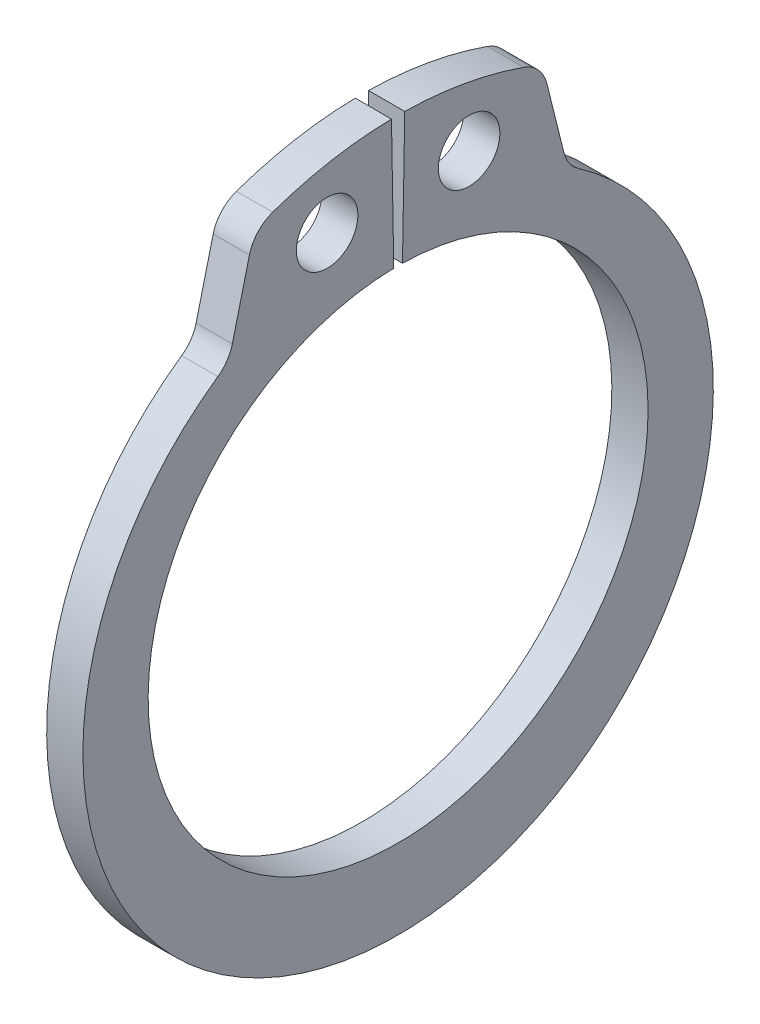
ISO-10303-21;
HEADER;
FILE_DESCRIPTION(('STEP AP214'),'2;1');
FILE_NAME('part.step','',(''),(''),'','','');
FILE_SCHEMA(('AUTOMOTIVE_DESIGN { 1 0 10303 214 1 1 1 1 }'));
ENDSEC;
DATA;
#1=APPLICATION_CONTEXT('core data for automotive mechanical design processes');
#2=APPLICATION_PROTOCOL_DEFINITION('international standard','automotive_design',2000,#1);
#3=PRODUCT_CONTEXT('',#1,'mechanical');
#4=PRODUCT('Part','Part','',(#3));
#5=PRODUCT_RELATED_PRODUCT_CATEGORY('part','',(#4));
#6=PRODUCT_DEFINITION_FORMATION('','',#4);
#7=PRODUCT_DEFINITION_CONTEXT('part definition',#1,'design');
#8=PRODUCT_DEFINITION('design','',#6,#7);
#9=PRODUCT_DEFINITION_SHAPE('','',#8);
#10=(LENGTH_UNIT() NAMED_UNIT(*) SI_UNIT(.MILLI.,.METRE.));
#11=(NAMED_UNIT(*) PLANE_ANGLE_UNIT() SI_UNIT($,.RADIAN.));
#12=(NAMED_UNIT(*) SI_UNIT($,.STERADIAN.) SOLID_ANGLE_UNIT());
#13=UNCERTAINTY_MEASURE_WITH_UNIT(LENGTH_MEASURE(1.E-05),#10,'distance_accuracy_value','');
#14=(GEOMETRIC_REPRESENTATION_CONTEXT(3) GLOBAL_UNCERTAINTY_ASSIGNED_CONTEXT((#13)) GLOBAL_UNIT_ASSIGNED_CONTEXT((#10,
#11,#12)) REPRESENTATION_CONTEXT('',''));
#15=CARTESIAN_POINT('',(0.,0.,0.));
#16=DIRECTION('',(0.,0.,1.));
#17=DIRECTION('',(1.,0.,0.));
#18=AXIS2_PLACEMENT_3D('',#15,#16,#17);
#19=CARTESIAN_POINT('',(0.5,0.,0.));
#20=DIRECTION('',(1.,0.,0.));
#21=DIRECTION('',(0.,0.,-1.));
#22=AXIS2_PLACEMENT_3D('',#19,#20,#21);
#23=PLANE('',#22);
#24=CARTESIAN_POINT('',(0.5,8.66711980549086,1.9596288316201));
#25=DIRECTION('',(1.,0.,0.));
#26=DIRECTION('',(0.,0.,-1.));
#27=AXIS2_PLACEMENT_3D('',#24,#25,#26);
#28=CIRCLE('',#27,0.85);
#29=CARTESIAN_POINT('',(0.5,8.66711980549086,1.1096288316201));
#30=VERTEX_POINT('',#29);
#31=EDGE_CURVE('E219',#30,#30,#28,.T.);
#32=ORIENTED_EDGE('',*,*,#31,.F.);
#33=EDGE_LOOP('',(#32));
#34=FACE_BOUND('',#33,.T.);
#35=CARTESIAN_POINT('',(0.5,0.,0.));
#36=DIRECTION('',(1.,0.,0.));
#37=DIRECTION('',(0.,0.,-1.));
#38=AXIS2_PLACEMENT_3D('',#35,#36,#37);
#39=CIRCLE('',#38,10.5);
#40=CARTESIAN_POINT('',(0.5,10.4984007991421,0.183250267591477));
#41=VERTEX_POINT('',#40);
#42=CARTESIAN_POINT('',(0.5,9.91217887924345,3.46391539531209));
#43=VERTEX_POINT('',#42);
#44=EDGE_CURVE('E136',#41,#43,#39,.T.);
#45=ORIENTED_EDGE('',*,*,#44,.T.);
#46=CARTESIAN_POINT('',(0.5,8.96816184312502,3.13401869099665));
#47=DIRECTION('',(1.,0.,0.));
#48=DIRECTION('',(0.,0.,-1.));
#49=AXIS2_PLACEMENT_3D('',#46,#47,#48);
#50=CIRCLE('',#49,1.);
#51=CARTESIAN_POINT('',(0.5,9.21008373872469,4.10431441727265));
#52=VERTEX_POINT('',#51);
#53=EDGE_CURVE('E173',#43,#52,#50,.T.);
#54=ORIENTED_EDGE('',*,*,#53,.T.);
#55=DIRECTION('',(0.,-0.970295726275997,0.241921895599665));
#56=VECTOR('',#55,1.);
#57=CARTESIAN_POINT('',(0.5,9.71734472745919,3.97784004803122));
#58=LINE('',#57,#56);
#59=CARTESIAN_POINT('',(0.5,7.31761530924591,4.57615979123836));
#60=VERTEX_POINT('',#59);
#61=EDGE_CURVE('E211',#52,#60,#58,.T.);
#62=ORIENTED_EDGE('',*,*,#61,.T.);
#63=CARTESIAN_POINT('',(0.5,7.55953720484558,5.54645551751436));
#64=DIRECTION('',(1.,0.,0.));
#65=DIRECTION('',(0.,0.,-1.));
#66=AXIS2_PLACEMENT_3D('',#63,#64,#65);
#67=CIRCLE('',#66,1.);
#68=CARTESIAN_POINT('',(0.5,6.73911195964233,4.97470170945253));
#69=VERTEX_POINT('',#68);
#70=EDGE_CURVE('E184',#60,#69,#67,.F.);
#71=ORIENTED_EDGE('',*,*,#70,.T.);
#72=CARTESIAN_POINT('',(0.5,-0.399224177769538,0.));
#73=DIRECTION('',(1.,0.,0.));
#74=DIRECTION('',(0.,0.,-1.));
#75=AXIS2_PLACEMENT_3D('',#72,#73,#74);
#76=CIRCLE('',#75,8.70077582223046);
#77=CARTESIAN_POINT('',(0.5,6.73911195964233,-4.97470170945253));
#78=VERTEX_POINT('',#77);
#79=EDGE_CURVE('E206',#69,#78,#76,.T.);
#80=ORIENTED_EDGE('',*,*,#79,.T.);
#81=CARTESIAN_POINT('',(0.5,7.55953720484557,-5.54645551751436));
#82=DIRECTION('',(1.,0.,0.));
#83=DIRECTION('',(0.,0.,-1.));
#84=AXIS2_PLACEMENT_3D('',#81,#82,#83);
#85=CIRCLE('',#84,1.);
#86=CARTESIAN_POINT('',(0.5,7.31761530924591,-4.57615979123836));
#87=VERTEX_POINT('',#86);
#88=EDGE_CURVE('E11',#78,#87,#85,.F.);
#89=ORIENTED_EDGE('',*,*,#88,.T.);
#90=DIRECTION('',(0.,0.970295726275997,0.241921895599666));
#91=VECTOR('',#90,1.);
#92=CARTESIAN_POINT('',(0.5,9.71734472745919,-3.97784004803122));
#93=LINE('',#92,#91);
#94=CARTESIAN_POINT('',(0.5,9.21008373872469,-4.10431441727265));
#95=VERTEX_POINT('',#94);
#96=EDGE_CURVE('E205',#87,#95,#93,.T.);
#97=ORIENTED_EDGE('',*,*,#96,.T.);
#98=CARTESIAN_POINT('',(0.5,8.96816184312502,-3.13401869099666));
#99=DIRECTION('',(1.,0.,0.));
#100=DIRECTION('',(0.,0.,-1.));
#101=AXIS2_PLACEMENT_3D('',#98,#99,#100);
#102=CIRCLE('',#101,1.);
#103=CARTESIAN_POINT('',(0.5,9.91217887924345,-3.46391539531209));
#104=VERTEX_POINT('',#103);
#105=EDGE_CURVE('E51',#95,#104,#102,.T.);
#106=ORIENTED_EDGE('',*,*,#105,.T.);
#107=CARTESIAN_POINT('',(0.5,0.,0.));
#108=DIRECTION('',(1.,0.,0.));
#109=DIRECTION('',(0.,0.,1.));
#110=AXIS2_PLACEMENT_3D('',#107,#108,#109);
#111=CIRCLE('',#110,10.5);
#112=CARTESIAN_POINT('',(0.5,10.4984007991421,-0.183250267591479));
#113=VERTEX_POINT('',#112);
#114=EDGE_CURVE('E208',#104,#113,#111,.T.);
#115=ORIENTED_EDGE('',*,*,#114,.T.);
#116=DIRECTION('',(0.,-0.999847695156391,0.0174524064372841));
#117=VECTOR('',#116,1.);
#118=CARTESIAN_POINT('',(0.5,10.4984007991421,-0.183250267591479));
#119=LINE('',#118,#117);
#120=CARTESIAN_POINT('',(0.5,6.8989490965791,-0.120421604417257));
#121=VERTEX_POINT('',#120);
#122=EDGE_CURVE('E142',#113,#121,#119,.T.);
#123=ORIENTED_EDGE('',*,*,#122,.T.);
#124=CARTESIAN_POINT('',(0.5,0.,0.));
#125=DIRECTION('',(-1.,0.,0.));
#126=DIRECTION('',(0.,0.,-1.));
#127=AXIS2_PLACEMENT_3D('',#124,#125,#126);
#128=CIRCLE('',#127,6.9);
#129=CARTESIAN_POINT('',(0.5,6.8989490965791,0.120421604417257));
#130=VERTEX_POINT('',#129);
#131=EDGE_CURVE('E137',#121,#130,#128,.T.);
#132=ORIENTED_EDGE('',*,*,#131,.T.);
#133=DIRECTION('',(0.,0.999847695156391,0.0174524064372835));
#134=VECTOR('',#133,1.);
#135=CARTESIAN_POINT('',(0.5,6.8989490965791,0.120421604417257));
#136=LINE('',#135,#134);
#137=EDGE_CURVE('E126',#130,#41,#136,.T.);
#138=ORIENTED_EDGE('',*,*,#137,.T.);
#139=EDGE_LOOP('',(#45,#54,#62,#71,#80,#89,#97,#106,#115,#123,#132,#138));
#140=FACE_BOUND('',#139,.T.);
#141=CARTESIAN_POINT('',(0.5,8.66711980549086,-1.9596288316201));
#142=DIRECTION('',(1.,0.,0.));
#143=DIRECTION('',(0.,0.,-1.));
#144=AXIS2_PLACEMENT_3D('',#141,#142,#143);
#145=CIRCLE('',#144,0.85);
#146=CARTESIAN_POINT('',(0.5,8.66711980549086,-2.8096288316201));
#147=VERTEX_POINT('',#146);
#148=EDGE_CURVE('E248',#147,#147,#145,.T.);
#149=ORIENTED_EDGE('',*,*,#148,.F.);
#150=EDGE_LOOP('',(#149));
#151=FACE_BOUND('',#150,.T.);
#152=ADVANCED_FACE('F36',(#34,#140,#151),#23,.T.);
#153=CARTESIAN_POINT('',(-0.5,0.,0.));
#154=DIRECTION('',(1.,0.,0.));
#155=DIRECTION('',(0.,0.,-1.));
#156=AXIS2_PLACEMENT_3D('',#153,#154,#155);
#157=PLANE('',#156);
#158=CARTESIAN_POINT('',(-0.5,8.66711980549086,1.9596288316201));
#159=DIRECTION('',(1.,0.,0.));
#160=DIRECTION('',(0.,0.,-1.));
#161=AXIS2_PLACEMENT_3D('',#158,#159,#160);
#162=CIRCLE('',#161,0.85);
#163=CARTESIAN_POINT('',(-0.5,8.66711980549086,1.1096288316201));
#164=VERTEX_POINT('',#163);
#165=EDGE_CURVE('E245',#164,#164,#162,.T.);
#166=ORIENTED_EDGE('',*,*,#165,.T.);
#167=EDGE_LOOP('',(#166));
#168=FACE_BOUND('',#167,.T.);
#169=DIRECTION('',(0.,-0.970295726275997,0.241921895599665));
#170=VECTOR('',#169,1.);
#171=CARTESIAN_POINT('',(-0.5,9.71734472745919,3.97784004803122));
#172=LINE('',#171,#170);
#173=CARTESIAN_POINT('',(-0.5,9.21008373872469,4.10431441727265));
#174=VERTEX_POINT('',#173);
#175=CARTESIAN_POINT('',(-0.5,7.31761530924591,4.57615979123836));
#176=VERTEX_POINT('',#175);
#177=EDGE_CURVE('E202',#174,#176,#172,.T.);
#178=ORIENTED_EDGE('',*,*,#177,.F.);
#179=CARTESIAN_POINT('',(-0.5,8.96816184312502,3.13401869099665));
#180=DIRECTION('',(1.,0.,0.));
#181=DIRECTION('',(0.,0.,-1.));
#182=AXIS2_PLACEMENT_3D('',#179,#180,#181);
#183=CIRCLE('',#182,1.);
#184=CARTESIAN_POINT('',(-0.5,9.91217887924345,3.46391539531209));
#185=VERTEX_POINT('',#184);
#186=EDGE_CURVE('E168',#174,#185,#183,.F.);
#187=ORIENTED_EDGE('',*,*,#186,.T.);
#188=CARTESIAN_POINT('',(-0.5,0.,0.));
#189=DIRECTION('',(1.,0.,0.));
#190=DIRECTION('',(0.,0.,-1.));
#191=AXIS2_PLACEMENT_3D('',#188,#189,#190);
#192=CIRCLE('',#191,10.5);
#193=CARTESIAN_POINT('',(-0.5,10.4984007991421,0.183250267591477));
#194=VERTEX_POINT('',#193);
#195=EDGE_CURVE('E221',#194,#185,#192,.T.);
#196=ORIENTED_EDGE('',*,*,#195,.F.);
#197=DIRECTION('',(0.,0.999847695156391,0.0174524064372835));
#198=VECTOR('',#197,1.);
#199=CARTESIAN_POINT('',(-0.5,6.8989490965791,0.120421604417257));
#200=LINE('',#199,#198);
#201=CARTESIAN_POINT('',(-0.5,6.8989490965791,0.120421604417257));
#202=VERTEX_POINT('',#201);
#203=EDGE_CURVE('E218',#202,#194,#200,.T.);
#204=ORIENTED_EDGE('',*,*,#203,.F.);
#205=CARTESIAN_POINT('',(-0.5,0.,0.));
#206=DIRECTION('',(-1.,0.,0.));
#207=DIRECTION('',(0.,0.,-1.));
#208=AXIS2_PLACEMENT_3D('',#205,#206,#207);
#209=CIRCLE('',#208,6.9);
#210=CARTESIAN_POINT('',(-0.5,6.8989490965791,-0.120421604417257));
#211=VERTEX_POINT('',#210);
#212=EDGE_CURVE('E150',#211,#202,#209,.T.);
#213=ORIENTED_EDGE('',*,*,#212,.F.);
#214=DIRECTION('',(0.,-0.999847695156391,0.0174524064372841));
#215=VECTOR('',#214,1.);
#216=CARTESIAN_POINT('',(-0.5,10.4984007991421,-0.183250267591479));
#217=LINE('',#216,#215);
#218=CARTESIAN_POINT('',(-0.5,10.4984007991421,-0.183250267591479));
#219=VERTEX_POINT('',#218);
#220=EDGE_CURVE('E146',#219,#211,#217,.T.);
#221=ORIENTED_EDGE('',*,*,#220,.F.);
#222=CARTESIAN_POINT('',(-0.5,0.,0.));
#223=DIRECTION('',(1.,0.,0.));
#224=DIRECTION('',(0.,0.,1.));
#225=AXIS2_PLACEMENT_3D('',#222,#223,#224);
#226=CIRCLE('',#225,10.5);
#227=CARTESIAN_POINT('',(-0.5,9.91217887924345,-3.46391539531209));
#228=VERTEX_POINT('',#227);
#229=EDGE_CURVE('E227',#228,#219,#226,.T.);
#230=ORIENTED_EDGE('',*,*,#229,.F.);
#231=CARTESIAN_POINT('',(-0.5,8.96816184312502,-3.13401869099666));
#232=DIRECTION('',(1.,0.,0.));
#233=DIRECTION('',(0.,0.,-1.));
#234=AXIS2_PLACEMENT_3D('',#231,#232,#233);
#235=CIRCLE('',#234,1.);
#236=CARTESIAN_POINT('',(-0.5,9.21008373872469,-4.10431441727265));
#237=VERTEX_POINT('',#236);
#238=EDGE_CURVE('E166',#228,#237,#235,.F.);
#239=ORIENTED_EDGE('',*,*,#238,.T.);
#240=DIRECTION('',(0.,0.970295726275997,0.241921895599666));
#241=VECTOR('',#240,1.);
#242=CARTESIAN_POINT('',(-0.5,9.71734472745919,-3.97784004803122));
#243=LINE('',#242,#241);
#244=CARTESIAN_POINT('',(-0.5,7.31761530924591,-4.57615979123836));
#245=VERTEX_POINT('',#244);
#246=EDGE_CURVE('E193',#245,#237,#243,.T.);
#247=ORIENTED_EDGE('',*,*,#246,.F.);
#248=CARTESIAN_POINT('',(-0.5,7.55953720484557,-5.54645551751436));
#249=DIRECTION('',(1.,0.,0.));
#250=DIRECTION('',(0.,0.,-1.));
#251=AXIS2_PLACEMENT_3D('',#248,#249,#250);
#252=CIRCLE('',#251,1.);
#253=CARTESIAN_POINT('',(-0.5,6.73911195964233,-4.97470170945253));
#254=VERTEX_POINT('',#253);
#255=EDGE_CURVE('E44',#245,#254,#252,.T.);
#256=ORIENTED_EDGE('',*,*,#255,.T.);
#257=CARTESIAN_POINT('',(-0.5,-0.399224177769538,0.));
#258=DIRECTION('',(1.,0.,0.));
#259=DIRECTION('',(0.,0.,-1.));
#260=AXIS2_PLACEMENT_3D('',#257,#258,#259);
#261=CIRCLE('',#260,8.70077582223046);
#262=CARTESIAN_POINT('',(-0.5,6.73911195964233,4.97470170945253));
#263=VERTEX_POINT('',#262);
#264=EDGE_CURVE('E192',#263,#254,#261,.T.);
#265=ORIENTED_EDGE('',*,*,#264,.F.);
#266=CARTESIAN_POINT('',(-0.5,7.55953720484558,5.54645551751436));
#267=DIRECTION('',(1.,0.,0.));
#268=DIRECTION('',(0.,0.,-1.));
#269=AXIS2_PLACEMENT_3D('',#266,#267,#268);
#270=CIRCLE('',#269,1.);
#271=EDGE_CURVE('E182',#263,#176,#270,.T.);
#272=ORIENTED_EDGE('',*,*,#271,.T.);
#273=EDGE_LOOP('',(#178,#187,#196,#204,#213,#221,#230,#239,#247,#256,#265,#272));
#274=FACE_BOUND('',#273,.T.);
#275=CARTESIAN_POINT('',(-0.5,8.66711980549086,-1.9596288316201));
#276=DIRECTION('',(1.,0.,0.));
#277=DIRECTION('',(0.,0.,-1.));
#278=AXIS2_PLACEMENT_3D('',#275,#276,#277);
#279=CIRCLE('',#278,0.85);
#280=CARTESIAN_POINT('',(-0.5,8.66711980549086,-2.8096288316201));
#281=VERTEX_POINT('',#280);
#282=EDGE_CURVE('E251',#281,#281,#279,.T.);
#283=ORIENTED_EDGE('',*,*,#282,.T.);
#284=EDGE_LOOP('',(#283));
#285=FACE_BOUND('',#284,.T.);
#286=ADVANCED_FACE('F190',(#168,#274,#285),#157,.F.);
#287=CARTESIAN_POINT('',(0.5,0.,0.));
#288=DIRECTION('',(-1.,0.,0.));
#289=DIRECTION('',(0.,0.,1.));
#290=AXIS2_PLACEMENT_3D('',#287,#288,#289);
#291=CYLINDRICAL_SURFACE('',#290,6.9);
#292=ORIENTED_EDGE('',*,*,#212,.T.);
#293=DIRECTION('',(-1.,0.,0.));
#294=VECTOR('',#293,1.);
#295=CARTESIAN_POINT('',(0.5,6.8989490965791,0.120421604417257));
#296=LINE('',#295,#294);
#297=EDGE_CURVE('E130',#130,#202,#296,.T.);
#298=ORIENTED_EDGE('',*,*,#297,.F.);
#299=ORIENTED_EDGE('',*,*,#131,.F.);
#300=DIRECTION('',(-1.,0.,0.));
#301=VECTOR('',#300,1.);
#302=CARTESIAN_POINT('',(0.5,6.8989490965791,-0.120421604417257));
#303=LINE('',#302,#301);
#304=EDGE_CURVE('E216',#121,#211,#303,.T.);
#305=ORIENTED_EDGE('',*,*,#304,.T.);
#306=EDGE_LOOP('',(#292,#298,#299,#305));
#307=FACE_BOUND('',#306,.T.);
#308=ADVANCED_FACE('F148',(#307),#291,.F.);
#309=CARTESIAN_POINT('',(0.5,6.8989490965791,0.120421604417257));
#310=DIRECTION('',(0.,-0.0174524064372835,0.999847695156391));
#311=DIRECTION('',(0.,-0.999847695156391,-0.0174524064372835));
#312=AXIS2_PLACEMENT_3D('',#309,#310,#311);
#313=PLANE('',#312);
#314=ORIENTED_EDGE('',*,*,#203,.T.);
#315=DIRECTION('',(-1.,0.,0.));
#316=VECTOR('',#315,1.);
#317=CARTESIAN_POINT('',(0.5,10.4984007991421,0.183250267591477));
#318=LINE('',#317,#316);
#319=EDGE_CURVE('E133',#41,#194,#318,.T.);
#320=ORIENTED_EDGE('',*,*,#319,.F.);
#321=ORIENTED_EDGE('',*,*,#137,.F.);
#322=ORIENTED_EDGE('',*,*,#297,.T.);
#323=EDGE_LOOP('',(#314,#320,#321,#322));
#324=FACE_BOUND('',#323,.T.);
#325=ADVANCED_FACE('F128',(#324),#313,.F.);
#326=CARTESIAN_POINT('',(0.5,0.,0.));
#327=DIRECTION('',(-1.,0.,0.));
#328=DIRECTION('',(0.,0.,1.));
#329=AXIS2_PLACEMENT_3D('',#326,#327,#328);
#330=CYLINDRICAL_SURFACE('',#329,10.5);
#331=ORIENTED_EDGE('',*,*,#195,.T.);
#332=DIRECTION('',(-1.,0.,0.));
#333=VECTOR('',#332,1.);
#334=CARTESIAN_POINT('',(0.5,9.91217887924345,3.46391539531209));
#335=LINE('',#334,#333);
#336=EDGE_CURVE('E170',#185,#43,#335,.F.);
#337=ORIENTED_EDGE('',*,*,#336,.T.);
#338=ORIENTED_EDGE('',*,*,#44,.F.);
#339=ORIENTED_EDGE('',*,*,#319,.T.);
#340=EDGE_LOOP('',(#331,#337,#338,#339));
#341=FACE_BOUND('',#340,.T.);
#342=ADVANCED_FACE('F239',(#341),#330,.T.);
#343=CARTESIAN_POINT('',(0.5,9.71734472745919,3.97784004803122));
#344=DIRECTION('',(0.,-0.241921895599665,-0.970295726275997));
#345=DIRECTION('',(0.,0.970295726275997,-0.241921895599665));
#346=AXIS2_PLACEMENT_3D('',#343,#344,#345);
#347=PLANE('',#346);
#348=ORIENTED_EDGE('',*,*,#177,.T.);
#349=DIRECTION('',(1.,0.,0.));
#350=VECTOR('',#349,1.);
#351=CARTESIAN_POINT('',(0.5,7.31761530924591,4.57615979123836));
#352=LINE('',#351,#350);
#353=EDGE_CURVE('E164',#176,#60,#352,.T.);
#354=ORIENTED_EDGE('',*,*,#353,.T.);
#355=ORIENTED_EDGE('',*,*,#61,.F.);
#356=DIRECTION('',(-1.,0.,0.));
#357=VECTOR('',#356,1.);
#358=CARTESIAN_POINT('',(0.5,9.21008373872469,4.10431441727265));
#359=LINE('',#358,#357);
#360=EDGE_CURVE('E161',#52,#174,#359,.T.);
#361=ORIENTED_EDGE('',*,*,#360,.T.);
#362=EDGE_LOOP('',(#348,#354,#355,#361));
#363=FACE_BOUND('',#362,.T.);
#364=ADVANCED_FACE('F281',(#363),#347,.F.);
#365=CARTESIAN_POINT('',(0.5,-0.399224177769538,0.));
#366=DIRECTION('',(-1.,0.,0.));
#367=DIRECTION('',(0.,0.,1.));
#368=AXIS2_PLACEMENT_3D('',#365,#366,#367);
#369=CYLINDRICAL_SURFACE('',#368,8.70077582223046);
#370=ORIENTED_EDGE('',*,*,#79,.F.);
#371=DIRECTION('',(-1.,0.,0.));
#372=VECTOR('',#371,1.);
#373=CARTESIAN_POINT('',(0.5,6.73911195964233,4.97470170945253));
#374=LINE('',#373,#372);
#375=EDGE_CURVE('E153',#69,#263,#374,.T.);
#376=ORIENTED_EDGE('',*,*,#375,.T.);
#377=ORIENTED_EDGE('',*,*,#264,.T.);
#378=DIRECTION('',(-1.,0.,0.));
#379=VECTOR('',#378,1.);
#380=CARTESIAN_POINT('',(0.5,6.73911195964233,-4.97470170945253));
#381=LINE('',#380,#379);
#382=EDGE_CURVE('E151',#254,#78,#381,.F.);
#383=ORIENTED_EDGE('',*,*,#382,.T.);
#384=EDGE_LOOP('',(#370,#376,#377,#383));
#385=FACE_BOUND('',#384,.T.);
#386=ADVANCED_FACE('F199',(#385),#369,.T.);
#387=CARTESIAN_POINT('',(0.5,9.71734472745919,-3.97784004803122));
#388=DIRECTION('',(0.,-0.241921895599666,0.970295726275997));
#389=DIRECTION('',(0.,-0.970295726275997,-0.241921895599666));
#390=AXIS2_PLACEMENT_3D('',#387,#388,#389);
#391=PLANE('',#390);
#392=ORIENTED_EDGE('',*,*,#246,.T.);
#393=DIRECTION('',(-1.,0.,0.));
#394=VECTOR('',#393,1.);
#395=CARTESIAN_POINT('',(0.5,9.21008373872469,-4.10431441727265));
#396=LINE('',#395,#394);
#397=EDGE_CURVE('E59',#237,#95,#396,.F.);
#398=ORIENTED_EDGE('',*,*,#397,.T.);
#399=ORIENTED_EDGE('',*,*,#96,.F.);
#400=DIRECTION('',(1.,0.,0.));
#401=VECTOR('',#400,1.);
#402=CARTESIAN_POINT('',(-0.5,7.31761530924591,-4.57615979123836));
#403=LINE('',#402,#401);
#404=EDGE_CURVE('E178',#87,#245,#403,.F.);
#405=ORIENTED_EDGE('',*,*,#404,.T.);
#406=EDGE_LOOP('',(#392,#398,#399,#405));
#407=FACE_BOUND('',#406,.T.);
#408=ADVANCED_FACE('F207',(#407),#391,.F.);
#409=CARTESIAN_POINT('',(0.5,0.,0.));
#410=DIRECTION('',(-1.,0.,0.));
#411=DIRECTION('',(0.,0.,1.));
#412=AXIS2_PLACEMENT_3D('',#409,#410,#411);
#413=CYLINDRICAL_SURFACE('',#412,10.5);
#414=ORIENTED_EDGE('',*,*,#114,.F.);
#415=DIRECTION('',(-1.,0.,0.));
#416=VECTOR('',#415,1.);
#417=CARTESIAN_POINT('',(0.5,9.91217887924345,-3.46391539531209));
#418=LINE('',#417,#416);
#419=EDGE_CURVE('E175',#104,#228,#418,.T.);
#420=ORIENTED_EDGE('',*,*,#419,.T.);
#421=ORIENTED_EDGE('',*,*,#229,.T.);
#422=DIRECTION('',(-1.,0.,0.));
#423=VECTOR('',#422,1.);
#424=CARTESIAN_POINT('',(0.5,10.4984007991421,-0.183250267591479));
#425=LINE('',#424,#423);
#426=EDGE_CURVE('E155',#113,#219,#425,.T.);
#427=ORIENTED_EDGE('',*,*,#426,.F.);
#428=EDGE_LOOP('',(#414,#420,#421,#427));
#429=FACE_BOUND('',#428,.T.);
#430=ADVANCED_FACE('F274',(#429),#413,.T.);
#431=CARTESIAN_POINT('',(0.5,10.4984007991421,-0.183250267591479));
#432=DIRECTION('',(0.,-0.0174524064372841,-0.999847695156391));
#433=DIRECTION('',(0.,0.999847695156391,-0.0174524064372841));
#434=AXIS2_PLACEMENT_3D('',#431,#432,#433);
#435=PLANE('',#434);
#436=ORIENTED_EDGE('',*,*,#220,.T.);
#437=ORIENTED_EDGE('',*,*,#304,.F.);
#438=ORIENTED_EDGE('',*,*,#122,.F.);
#439=ORIENTED_EDGE('',*,*,#426,.T.);
#440=EDGE_LOOP('',(#436,#437,#438,#439));
#441=FACE_BOUND('',#440,.T.);
#442=ADVANCED_FACE('F234',(#441),#435,.F.);
#443=CARTESIAN_POINT('',(0.5,8.66711980549086,1.9596288316201));
#444=DIRECTION('',(-1.,0.,0.));
#445=DIRECTION('',(0.,0.,1.));
#446=AXIS2_PLACEMENT_3D('',#443,#444,#445);
#447=CYLINDRICAL_SURFACE('',#446,0.85);
#448=ORIENTED_EDGE('',*,*,#31,.T.);
#449=EDGE_LOOP('',(#448));
#450=FACE_BOUND('',#449,.T.);
#451=ORIENTED_EDGE('',*,*,#165,.F.);
#452=EDGE_LOOP('',(#451));
#453=FACE_BOUND('',#452,.T.);
#454=ADVANCED_FACE('F269',(#450,#453),#447,.F.);
#455=CARTESIAN_POINT('',(0.5,8.66711980549086,-1.9596288316201));
#456=DIRECTION('',(-1.,0.,0.));
#457=DIRECTION('',(0.,0.,1.));
#458=AXIS2_PLACEMENT_3D('',#455,#456,#457);
#459=CYLINDRICAL_SURFACE('',#458,0.85);
#460=ORIENTED_EDGE('',*,*,#148,.T.);
#461=EDGE_LOOP('',(#460));
#462=FACE_BOUND('',#461,.T.);
#463=ORIENTED_EDGE('',*,*,#282,.F.);
#464=EDGE_LOOP('',(#463));
#465=FACE_BOUND('',#464,.T.);
#466=ADVANCED_FACE('F257',(#462,#465),#459,.F.);
#467=CARTESIAN_POINT('',(0.5,7.55953720484558,5.54645551751436));
#468=DIRECTION('',(-1.,0.,0.));
#469=DIRECTION('',(0.,0.,1.));
#470=AXIS2_PLACEMENT_3D('',#467,#468,#469);
#471=CYLINDRICAL_SURFACE('',#470,1.);
#472=ORIENTED_EDGE('',*,*,#70,.F.);
#473=ORIENTED_EDGE('',*,*,#353,.F.);
#474=ORIENTED_EDGE('',*,*,#271,.F.);
#475=ORIENTED_EDGE('',*,*,#375,.F.);
#476=EDGE_LOOP('',(#472,#473,#474,#475));
#477=FACE_BOUND('',#476,.T.);
#478=ADVANCED_FACE('F291',(#477),#471,.F.);
#479=CARTESIAN_POINT('',(0.5,8.96816184312502,3.13401869099665));
#480=DIRECTION('',(-1.,0.,0.));
#481=DIRECTION('',(0.,0.,1.));
#482=AXIS2_PLACEMENT_3D('',#479,#480,#481);
#483=CYLINDRICAL_SURFACE('',#482,1.);
#484=ORIENTED_EDGE('',*,*,#53,.F.);
#485=ORIENTED_EDGE('',*,*,#336,.F.);
#486=ORIENTED_EDGE('',*,*,#186,.F.);
#487=ORIENTED_EDGE('',*,*,#360,.F.);
#488=EDGE_LOOP('',(#484,#485,#486,#487));
#489=FACE_BOUND('',#488,.T.);
#490=ADVANCED_FACE('F294',(#489),#483,.T.);
#491=CARTESIAN_POINT('',(0.5,8.96816184312502,-3.13401869099666));
#492=DIRECTION('',(-1.,0.,0.));
#493=DIRECTION('',(0.,0.,1.));
#494=AXIS2_PLACEMENT_3D('',#491,#492,#493);
#495=CYLINDRICAL_SURFACE('',#494,1.);
#496=ORIENTED_EDGE('',*,*,#105,.F.);
#497=ORIENTED_EDGE('',*,*,#397,.F.);
#498=ORIENTED_EDGE('',*,*,#238,.F.);
#499=ORIENTED_EDGE('',*,*,#419,.F.);
#500=EDGE_LOOP('',(#496,#497,#498,#499));
#501=FACE_BOUND('',#500,.T.);
#502=ADVANCED_FACE('F297',(#501),#495,.T.);
#503=CARTESIAN_POINT('',(0.5,7.55953720484557,-5.54645551751436));
#504=DIRECTION('',(-1.,0.,0.));
#505=DIRECTION('',(0.,0.,1.));
#506=AXIS2_PLACEMENT_3D('',#503,#504,#505);
#507=CYLINDRICAL_SURFACE('',#506,1.);
#508=ORIENTED_EDGE('',*,*,#88,.F.);
#509=ORIENTED_EDGE('',*,*,#382,.F.);
#510=ORIENTED_EDGE('',*,*,#255,.F.);
#511=ORIENTED_EDGE('',*,*,#404,.F.);
#512=EDGE_LOOP('',(#508,#509,#510,#511));
#513=FACE_BOUND('',#512,.T.);
#514=ADVANCED_FACE('F38',(#513),#507,.F.);
#515=CLOSED_SHELL('',(#152,#286,#308,#325,#342,#364,#386,#408,#430,#442,#454,#466,#478,#490,
#502,#514));
#516=MANIFOLD_SOLID_BREP('B2',#515);
#517=ADVANCED_BREP_SHAPE_REPRESENTATION('',(#18,#516),#14);
#518=SHAPE_DEFINITION_REPRESENTATION(#9,#517);
ENDSEC;
END-ISO-10303-21;
